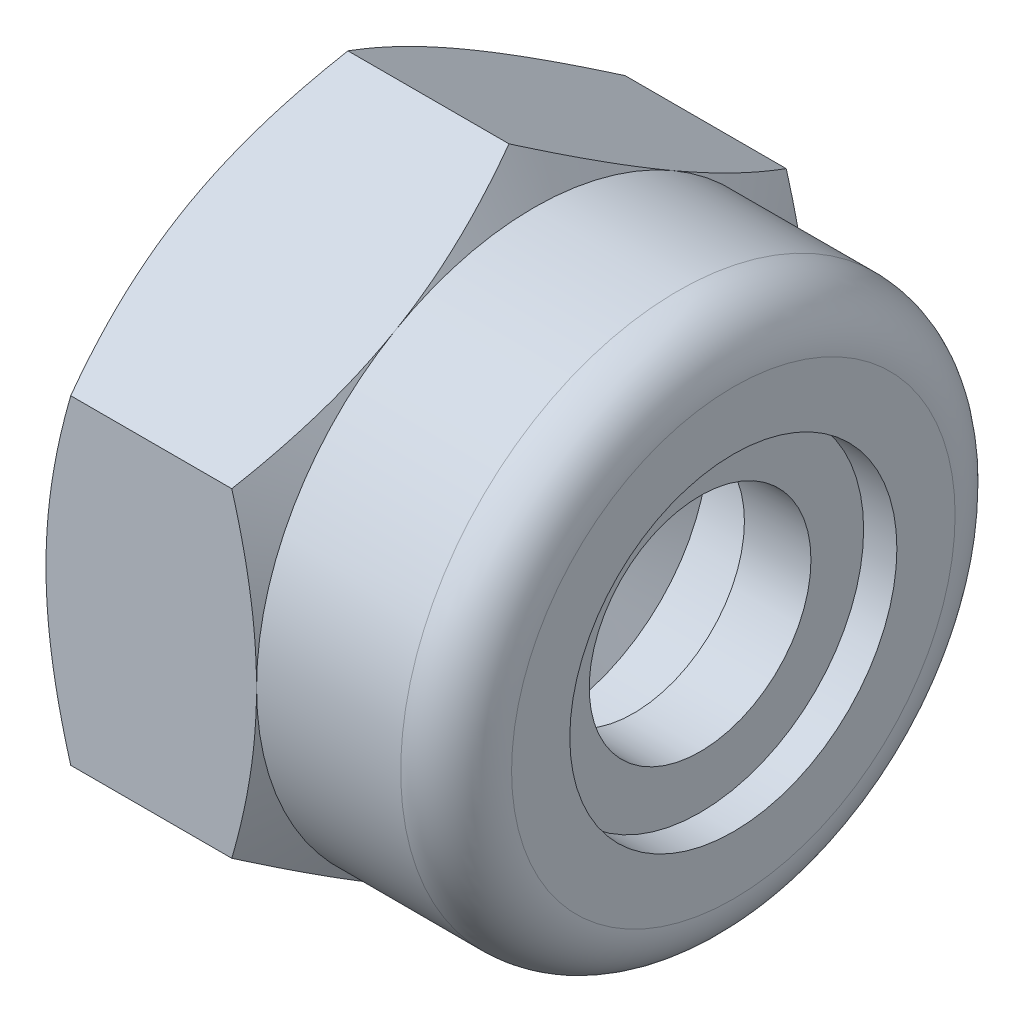
ISO-10303-21;
HEADER;
FILE_DESCRIPTION(('STEP AP214'),'2;1');
FILE_NAME('part.step','',(''),(''),'','','');
FILE_SCHEMA(('AUTOMOTIVE_DESIGN { 1 0 10303 214 1 1 1 1 }'));
ENDSEC;
DATA;
#1=APPLICATION_CONTEXT('core data for automotive mechanical design processes');
#2=APPLICATION_PROTOCOL_DEFINITION('international standard','automotive_design',2000,#1);
#3=PRODUCT_CONTEXT('',#1,'mechanical');
#4=PRODUCT('Part','Part','',(#3));
#5=PRODUCT_RELATED_PRODUCT_CATEGORY('part','',(#4));
#6=PRODUCT_DEFINITION_FORMATION('','',#4);
#7=PRODUCT_DEFINITION_CONTEXT('part definition',#1,'design');
#8=PRODUCT_DEFINITION('design','',#6,#7);
#9=PRODUCT_DEFINITION_SHAPE('','',#8);
#10=(LENGTH_UNIT() NAMED_UNIT(*) SI_UNIT(.MILLI.,.METRE.));
#11=(NAMED_UNIT(*) PLANE_ANGLE_UNIT() SI_UNIT($,.RADIAN.));
#12=(NAMED_UNIT(*) SI_UNIT($,.STERADIAN.) SOLID_ANGLE_UNIT());
#13=UNCERTAINTY_MEASURE_WITH_UNIT(LENGTH_MEASURE(1.E-05),#10,'distance_accuracy_value','');
#14=(GEOMETRIC_REPRESENTATION_CONTEXT(3) GLOBAL_UNCERTAINTY_ASSIGNED_CONTEXT((#13)) GLOBAL_UNIT_ASSIGNED_CONTEXT((#10,
#11,#12)) REPRESENTATION_CONTEXT('',''));
#15=CARTESIAN_POINT('',(0.,0.,0.));
#16=DIRECTION('',(0.,0.,1.));
#17=DIRECTION('',(1.,0.,0.));
#18=AXIS2_PLACEMENT_3D('',#15,#16,#17);
#19=CARTESIAN_POINT('',(3.801,-2.88675134594813,0.));
#20=DIRECTION('',(0.,0.866025403784439,0.5));
#21=DIRECTION('',(0.,-0.5,0.866025403784439));
#22=AXIS2_PLACEMENT_3D('',#19,#20,#21);
#23=PLANE('',#22);
#24=CARTESIAN_POINT('',(0.324252920315603,-1.44337562710054,-2.50000000443889));
#25=CARTESIAN_POINT('',(0.287622335702069,-1.50680326676873,-2.39014015800328));
#26=CARTESIAN_POINT('',(0.254308743347033,-1.5707784016051,-2.27933199376709));
#27=CARTESIAN_POINT('',(0.196160874493555,-1.69983634788501,-2.05579708814923));
#28=CARTESIAN_POINT('',(0.171347166263004,-1.76492145166663,-1.94306637626141));
#29=CARTESIAN_POINT('',(0.132722839049696,-1.89428509469182,-1.71900197010454));
#30=CARTESIAN_POINT('',(0.118655123807044,-1.95854373518774,-1.60770274131095));
#31=CARTESIAN_POINT('',(0.10186434826451,-2.08736321594889,-1.3845808566237));
#32=CARTESIAN_POINT('',(0.0991273804234783,-2.15192358831274,-1.27275901116118));
#33=CARTESIAN_POINT('',(0.104835750413544,-2.27254771379541,-1.06383189697324));
#34=CARTESIAN_POINT('',(0.111879493400295,-2.32862956753363,-0.966695276995339));
#35=CARTESIAN_POINT('',(0.134199510127339,-2.44042791999709,-0.773054850384702));
#36=CARTESIAN_POINT('',(0.149483400873592,-2.49614403233061,-0.676551713001986));
#37=CARTESIAN_POINT('',(0.18769016963491,-2.60817270000859,-0.482512368662393));
#38=CARTESIAN_POINT('',(0.210774928086408,-2.66447108376736,-0.385000707612505));
#39=CARTESIAN_POINT('',(0.263167570547475,-2.77622840386705,-0.191431351090719));
#40=CARTESIAN_POINT('',(0.292463152279787,-2.83168877084305,-0.0953711776861795));
#41=CARTESIAN_POINT('',(0.324252863035129,-2.88675130265926,-7.49785240252429E-08));
#42=B_SPLINE_CURVE_WITH_KNOTS('',3,(#24,#25,#26,#27,#28,#29,#30,#31,#32,#33,#34,#35,#36,#37,#38,
#39,#40,#41),.UNSPECIFIED.,.F.,.F.,(4,2,2,2,2,2,2,2,4),(0.,0.396270023168304,0.793492288044913,
1.18088453121035,1.56780114168793,1.90463473745514,2.24178022975287,2.58640199361272,
2.93034741081188),.UNSPECIFIED.);
#43=CARTESIAN_POINT('',(0.324252892837931,-1.44337566464297,-2.50000001442988));
#44=VERTEX_POINT('',#43);
#45=CARTESIAN_POINT('',(0.324252892836171,-2.88675135427618,-1.44246030499073E-08));
#46=VERTEX_POINT('',#45);
#47=EDGE_CURVE('E120',#44,#46,#42,.T.);
#48=ORIENTED_EDGE('',*,*,#47,.F.);
#49=DIRECTION('',(1.,0.,0.));
#50=VECTOR('',#49,1.);
#51=CARTESIAN_POINT('',(3.801,-1.44337567297414,-2.49999999999986));
#52=LINE('',#51,#50);
#53=CARTESIAN_POINT('',(1.77670900631172,-1.44337567297443,-2.50000000000037));
#54=VERTEX_POINT('',#53);
#55=EDGE_CURVE('E124',#54,#44,#52,.F.);
#56=ORIENTED_EDGE('',*,*,#55,.F.);
#57=CARTESIAN_POINT('',(2.00000000000824,-2.1650635094611,-1.25));
#58=CARTESIAN_POINT('',(2.00000781251923,-2.13443012113611,-1.30305858498687));
#59=CARTESIAN_POINT('',(1.9986989024449,-2.10380089093656,-1.35610996788921));
#60=CARTESIAN_POINT('',(1.99351636247017,-2.04260257269059,-1.462108564429));
#61=CARTESIAN_POINT('',(1.98964324030326,-2.01203347393929,-1.51505579660785));
#62=CARTESIAN_POINT('',(1.97433271109433,-1.92079117167452,-1.67309209992997));
#63=CARTESIAN_POINT('',(1.95920267491783,-1.86026561761744,-1.7779254347131));
#64=CARTESIAN_POINT('',(1.92029536388515,-1.74001256698161,-1.98620982817951));
#65=CARTESIAN_POINT('',(1.89652773316183,-1.68028425706462,-2.08966229560596));
#66=CARTESIAN_POINT('',(1.84171388393095,-1.56134139506079,-2.29567737579423));
#67=CARTESIAN_POINT('',(1.81063131493144,-1.50213099242487,-2.39823280149626));
#68=CARTESIAN_POINT('',(1.77670900631177,-1.44337567297364,-2.50000000000074));
#69=B_SPLINE_CURVE_WITH_KNOTS('',3,(#57,#58,#59,#60,#61,#62,#63,#64,#65,#66,#67,#68),
.UNSPECIFIED.,.F.,.F.,(4,2,2,2,2,4),(0.,0.183770844250406,0.367505311354719,0.733076121363491,
1.09824000837607,1.46525833757183),.UNSPECIFIED.);
#70=CARTESIAN_POINT('',(2.00000000000412,-2.1650635094611,-1.25));
#71=VERTEX_POINT('',#70);
#72=EDGE_CURVE('E111',#71,#54,#69,.T.);
#73=ORIENTED_EDGE('',*,*,#72,.F.);
#74=CARTESIAN_POINT('',(1.77670900631166,-2.88675134594874,1.06484877804142E-12));
#75=CARTESIAN_POINT('',(1.81063131493134,-2.8279960264975,-0.101767198503436));
#76=CARTESIAN_POINT('',(1.84171388393087,-2.76878562386156,-0.204322624205487));
#77=CARTESIAN_POINT('',(1.89652773316177,-2.64984276185771,-0.410337704393817));
#78=CARTESIAN_POINT('',(1.9202953638851,-2.5901144519407,-0.51379017182029));
#79=CARTESIAN_POINT('',(1.95920267491781,-2.46986140130484,-0.722074565286756));
#80=CARTESIAN_POINT('',(1.97433271109431,-2.40933584724774,-0.82690790006991));
#81=CARTESIAN_POINT('',(1.98964324030326,-2.31809354498295,-0.984944203392079));
#82=CARTESIAN_POINT('',(1.99351636247017,-2.28752444623164,-1.03789143557094));
#83=CARTESIAN_POINT('',(1.9986989024449,-2.22632612798565,-1.14389003211076));
#84=CARTESIAN_POINT('',(2.00000781251923,-2.1956968977861,-1.19694141501311));
#85=CARTESIAN_POINT('',(2.00000000000824,-2.1650635094611,-1.25));
#86=B_SPLINE_CURVE_WITH_KNOTS('',3,(#74,#75,#76,#77,#78,#79,#80,#81,#82,#83,#84,#85),
.UNSPECIFIED.,.F.,.F.,(4,2,2,2,2,4),(0.,0.367018329195855,0.732182216208531,1.0977530262174,
1.28148749332176,1.46525833757222),.UNSPECIFIED.);
#87=CARTESIAN_POINT('',(1.77670900631166,-2.88675134594874,0.));
#88=VERTEX_POINT('',#87);
#89=EDGE_CURVE('E97',#88,#71,#86,.T.);
#90=ORIENTED_EDGE('',*,*,#89,.F.);
#91=DIRECTION('',(1.,0.,0.));
#92=VECTOR('',#91,1.);
#93=CARTESIAN_POINT('',(3.801,-2.88675134594813,0.));
#94=LINE('',#93,#92);
#95=EDGE_CURVE('E103',#88,#46,#94,.F.);
#96=ORIENTED_EDGE('',*,*,#95,.T.);
#97=EDGE_LOOP('',(#48,#56,#73,#90,#96));
#98=FACE_BOUND('',#97,.T.);
#99=ADVANCED_FACE('F17',(#98),#23,.F.);
#100=CARTESIAN_POINT('',(3.801,-1.44337567297406,2.5));
#101=DIRECTION('',(0.,0.866025403784439,-0.5));
#102=DIRECTION('',(0.,0.5,0.866025403784439));
#103=AXIS2_PLACEMENT_3D('',#100,#101,#102);
#104=PLANE('',#103);
#105=CARTESIAN_POINT('',(0.324252920296346,-2.88675132687413,-4.19273291454504E-08));
#106=CARTESIAN_POINT('',(0.287622335693659,-2.82332372882424,0.109859828537716));
#107=CARTESIAN_POINT('',(0.254308743343429,-2.75934861106157,0.220668002630687));
#108=CARTESIAN_POINT('',(0.196160874494061,-2.63029067730084,0.444202915473586));
#109=CARTESIAN_POINT('',(0.171347166262811,-2.56520556891263,0.556933624699607));
#110=CARTESIAN_POINT('',(0.132722839049245,-2.43584192261218,0.780998028961931));
#111=CARTESIAN_POINT('',(0.11865512380703,-2.37158328330348,0.892297258439541));
#112=CARTESIAN_POINT('',(0.101864348264771,-2.24276380340565,1.11541914362221));
#113=CARTESIAN_POINT('',(0.0991273804235726,-2.17820343071977,1.2272409888972));
#114=CARTESIAN_POINT('',(0.104835750413159,-2.05757930503713,1.43616810296488));
#115=CARTESIAN_POINT('',(0.111879493399489,-2.00149745136899,1.53330472298003));
#116=CARTESIAN_POINT('',(0.134199510125296,-1.88969909895897,1.72694514961523));
#117=CARTESIAN_POINT('',(0.149483400870735,-1.83398298660874,1.82344828698519));
#118=CARTESIAN_POINT('',(0.187690169630089,-1.72195431891877,2.0174876313114));
#119=CARTESIAN_POINT('',(0.210774928080413,-1.66565593516519,2.11499929236093));
#120=CARTESIAN_POINT('',(0.263167570538905,-1.55389861507584,2.30856864888203));
#121=CARTESIAN_POINT('',(0.292463152269813,-1.498438248105,2.40462882228624));
#122=CARTESIAN_POINT('',(0.324252863023689,-1.44337571628275,2.49999992498716));
#123=B_SPLINE_CURVE_WITH_KNOTS('',3,(#105,#106,#107,#108,#109,#110,#111,#112,#113,#114,#115,
#116,#117,#118,#119,#120,#121,#122),.UNSPECIFIED.,.F.,.F.,(4,2,2,2,2,2,2,2,4),(0.,
0.396270023162889,0.793492288034561,1.18088453119609,1.56780114166958,1.90463473742841,
2.24178022971785,2.58640199356846,2.93034741075827),.UNSPECIFIED.);
#124=CARTESIAN_POINT('',(0.324252892835598,-1.44337568962818,2.5));
#125=VERTEX_POINT('',#124);
#126=EDGE_CURVE('E116',#46,#125,#123,.T.);
#127=ORIENTED_EDGE('',*,*,#126,.F.);
#128=ORIENTED_EDGE('',*,*,#95,.F.);
#129=CARTESIAN_POINT('',(2.00000000000824,-2.1650635094611,1.25));
#130=CARTESIAN_POINT('',(2.00000781251923,-2.1956968977861,1.19694141501311));
#131=CARTESIAN_POINT('',(1.9986989024449,-2.22632612798565,1.14389003211076));
#132=CARTESIAN_POINT('',(1.99351636247017,-2.28752444623164,1.03789143557094));
#133=CARTESIAN_POINT('',(1.98964324030326,-2.31809354498295,0.984944203392079));
#134=CARTESIAN_POINT('',(1.97433271109431,-2.40933584724774,0.82690790006991));
#135=CARTESIAN_POINT('',(1.95920267491781,-2.46986140130484,0.722074565286756));
#136=CARTESIAN_POINT('',(1.9202953638851,-2.5901144519407,0.513790171820291));
#137=CARTESIAN_POINT('',(1.89652773316177,-2.64984276185771,0.410337704393817));
#138=CARTESIAN_POINT('',(1.84171388393087,-2.76878562386156,0.204322624205487));
#139=CARTESIAN_POINT('',(1.81063131493134,-2.8279960264975,0.101767198503436));
#140=CARTESIAN_POINT('',(1.77670900631166,-2.88675134594874,-1.06488478110508E-12));
#141=B_SPLINE_CURVE_WITH_KNOTS('',3,(#129,#130,#131,#132,#133,#134,#135,#136,#137,#138,#139,
#140),.UNSPECIFIED.,.F.,.F.,(4,2,2,2,2,4),(0.,0.183770844250456,0.367505311354819,
0.733076121363689,1.09824000837636,1.46525833757222),.UNSPECIFIED.);
#142=CARTESIAN_POINT('',(2.00000000000412,-2.1650635094611,1.25));
#143=VERTEX_POINT('',#142);
#144=EDGE_CURVE('E94',#143,#88,#141,.T.);
#145=ORIENTED_EDGE('',*,*,#144,.F.);
#146=CARTESIAN_POINT('',(1.77670900631171,-1.44337567297354,2.50000000000092));
#147=CARTESIAN_POINT('',(1.81063131493138,-1.50213099242478,2.39823280149643));
#148=CARTESIAN_POINT('',(1.84171388393091,-1.56134139506071,2.29567737579439));
#149=CARTESIAN_POINT('',(1.8965277331618,-1.68028425706455,2.08966229560608));
#150=CARTESIAN_POINT('',(1.92029536388512,-1.74001256698154,1.98620982817962));
#151=CARTESIAN_POINT('',(1.95920267491782,-1.86026561761739,1.77792543471318));
#152=CARTESIAN_POINT('',(1.97433271109432,-1.92079117167449,1.67309209993004));
#153=CARTESIAN_POINT('',(1.98964324030326,-2.01203347393926,1.51505579660789));
#154=CARTESIAN_POINT('',(1.99351636247017,-2.04260257269057,1.46210856442903));
#155=CARTESIAN_POINT('',(1.9986989024449,-2.10380089093655,1.35610996788923));
#156=CARTESIAN_POINT('',(2.00000781251923,-2.1344301211361,1.30305858498688));
#157=CARTESIAN_POINT('',(2.00000000000824,-2.1650635094611,1.25));
#158=B_SPLINE_CURVE_WITH_KNOTS('',3,(#146,#147,#148,#149,#150,#151,#152,#153,#154,#155,#156,
#157),.UNSPECIFIED.,.F.,.F.,(4,2,2,2,2,4),(0.,0.367018329195811,0.732182216208443,
1.09775302621727,1.28148749332161,1.46525833757204),.UNSPECIFIED.);
#159=CARTESIAN_POINT('',(1.77670900631186,-1.44337567297459,2.5));
#160=VERTEX_POINT('',#159);
#161=EDGE_CURVE('E104',#160,#143,#158,.T.);
#162=ORIENTED_EDGE('',*,*,#161,.F.);
#163=DIRECTION('',(1.,0.,0.));
#164=VECTOR('',#163,1.);
#165=CARTESIAN_POINT('',(3.801,-1.44337567297406,2.5));
#166=LINE('',#165,#164);
#167=EDGE_CURVE('E118',#125,#160,#166,.T.);
#168=ORIENTED_EDGE('',*,*,#167,.F.);
#169=EDGE_LOOP('',(#127,#128,#145,#162,#168));
#170=FACE_BOUND('',#169,.T.);
#171=ADVANCED_FACE('F113',(#170),#104,.F.);
#172=CARTESIAN_POINT('',(0.,0.,0.));
#173=DIRECTION('',(-1.,0.,0.));
#174=DIRECTION('',(0.,0.,1.));
#175=AXIS2_PLACEMENT_3D('',#172,#173,#174);
#176=CONICAL_SURFACE('',#175,1.47500000002765,1.04719755119663);
#177=CARTESIAN_POINT('',(0.274241377865073,0.,0.));
#178=DIRECTION('',(1.,0.,0.));
#179=DIRECTION('',(0.,0.,-1.));
#180=AXIS2_PLACEMENT_3D('',#177,#178,#179);
#181=CIRCLE('',#180,1.);
#182=CARTESIAN_POINT('',(0.274241377865073,0.,-1.));
#183=VERTEX_POINT('',#182);
#184=EDGE_CURVE('E240',#183,#183,#181,.T.);
#185=ORIENTED_EDGE('',*,*,#184,.T.);
#186=EDGE_LOOP('',(#185));
#187=FACE_BOUND('',#186,.T.);
#188=CARTESIAN_POINT('',(0.,0.,0.));
#189=DIRECTION('',(-1.,0.,0.));
#190=DIRECTION('',(0.,0.,1.));
#191=AXIS2_PLACEMENT_3D('',#188,#189,#190);
#192=CIRCLE('',#191,1.47500000002765);
#193=CARTESIAN_POINT('',(0.,0.,1.47500000002765));
#194=VERTEX_POINT('',#193);
#195=EDGE_CURVE('E242',#194,#194,#192,.F.);
#196=ORIENTED_EDGE('',*,*,#195,.F.);
#197=EDGE_LOOP('',(#196));
#198=FACE_BOUND('',#197,.T.);
#199=ADVANCED_FACE('F452',(#187,#198),#176,.F.);
#200=CARTESIAN_POINT('',(3.8,0.,0.));
#201=DIRECTION('',(1.,0.,0.));
#202=DIRECTION('',(0.,0.,-1.));
#203=AXIS2_PLACEMENT_3D('',#200,#201,#202);
#204=CYLINDRICAL_SURFACE('',#203,1.);
#205=CARTESIAN_POINT('',(1.82672051647614,0.,0.));
#206=DIRECTION('',(1.,0.,0.));
#207=DIRECTION('',(0.,0.,-1.));
#208=AXIS2_PLACEMENT_3D('',#205,#206,#207);
#209=CIRCLE('',#208,0.999999999976353);
#210=CARTESIAN_POINT('',(1.82672051647614,0.,-0.999999999976353));
#211=VERTEX_POINT('',#210);
#212=EDGE_CURVE('E234',#211,#211,#209,.T.);
#213=ORIENTED_EDGE('',*,*,#212,.T.);
#214=EDGE_LOOP('',(#213));
#215=FACE_BOUND('',#214,.T.);
#216=ORIENTED_EDGE('',*,*,#184,.F.);
#217=EDGE_LOOP('',(#216));
#218=FACE_BOUND('',#217,.T.);
#219=ADVANCED_FACE('F449',(#215,#218),#204,.F.);
#220=CARTESIAN_POINT('',(0.,2.32512886940356,0.));
#221=DIRECTION('',(-1.,0.,0.));
#222=DIRECTION('',(0.,0.,1.));
#223=AXIS2_PLACEMENT_3D('',#220,#221,#222);
#224=PLANE('',#223);
#225=CARTESIAN_POINT('',(-1.52311973797281E-11,0.,0.));
#226=DIRECTION('',(1.,0.,0.));
#227=DIRECTION('',(0.,0.,-1.));
#228=AXIS2_PLACEMENT_3D('',#225,#226,#227);
#229=CIRCLE('',#228,2.32512886935865);
#230=CARTESIAN_POINT('',(-1.52311973797281E-11,0.,-2.32512886935865));
#231=VERTEX_POINT('',#230);
#232=EDGE_CURVE('E239',#231,#231,#229,.T.);
#233=ORIENTED_EDGE('',*,*,#232,.F.);
#234=EDGE_LOOP('',(#233));
#235=FACE_BOUND('',#234,.T.);
#236=ORIENTED_EDGE('',*,*,#195,.T.);
#237=EDGE_LOOP('',(#236));
#238=FACE_BOUND('',#237,.T.);
#239=ADVANCED_FACE('F305',(#235,#238),#224,.T.);
#240=CARTESIAN_POINT('',(3.801,2.88675134594813,0.));
#241=DIRECTION('',(0.,-0.866025403784439,-0.5));
#242=DIRECTION('',(0.,0.5,-0.866025403784439));
#243=AXIS2_PLACEMENT_3D('',#240,#241,#242);
#244=PLANE('',#243);
#245=CARTESIAN_POINT('',(0.324252920315311,1.443375627101,2.5000000044384));
#246=CARTESIAN_POINT('',(0.287622335701857,1.5068032667691,2.39014015800274));
#247=CARTESIAN_POINT('',(0.254308743346865,1.57077840160543,2.27933199376654));
#248=CARTESIAN_POINT('',(0.196160874493444,1.6998363478853,2.05579708814871));
#249=CARTESIAN_POINT('',(0.171347166262905,1.76492145166691,1.94306637626091));
#250=CARTESIAN_POINT('',(0.132722839049628,1.89428509469209,1.71900197010407));
#251=CARTESIAN_POINT('',(0.118655123806995,1.958543735188,1.6077027413105));
#252=CARTESIAN_POINT('',(0.101864348264494,2.08736321594913,1.38458085662329));
#253=CARTESIAN_POINT('',(0.0991273804234762,2.15192358831297,1.27275901116078));
#254=CARTESIAN_POINT('',(0.10483575041356,2.27254771379551,1.06383189697306));
#255=CARTESIAN_POINT('',(0.111879493400299,2.32862956753361,0.966695276995364));
#256=CARTESIAN_POINT('',(0.134199510127283,2.44042791999685,0.77305485038513));
#257=CARTESIAN_POINT('',(0.149483400873489,2.49614403233025,0.676551713002614));
#258=CARTESIAN_POINT('',(0.187690169634685,2.60817270000799,0.482512368663427));
#259=CARTESIAN_POINT('',(0.210774928086105,2.66447108376665,0.385000707613745));
#260=CARTESIAN_POINT('',(0.263167570546997,2.77622840386611,0.191431351092364));
#261=CARTESIAN_POINT('',(0.29246315227921,2.83168877084198,0.0953711776880236));
#262=CARTESIAN_POINT('',(0.324252863034449,2.88675130265808,7.49805642180318E-08));
#263=B_SPLINE_CURVE_WITH_KNOTS('',3,(#245,#246,#247,#248,#249,#250,#251,#252,#253,#254,#255,
#256,#257,#258,#259,#260,#261,#262),.UNSPECIFIED.,.F.,.F.,(4,2,2,2,2,2,2,2,4),(0.,
0.396270023168229,0.793492288044763,1.18088453121014,1.56780114168766,1.90463473745416,
2.24178022975119,2.5864019936103,2.93034741080872),.UNSPECIFIED.);
#264=CARTESIAN_POINT('',(0.324252892837855,1.4433756646431,2.50000001442966));
#265=VERTEX_POINT('',#264);
#266=CARTESIAN_POINT('',(0.324252875531209,2.8867513243031,3.74902820057411E-08));
#267=VERTEX_POINT('',#266);
#268=EDGE_CURVE('E295',#265,#267,#263,.T.);
#269=ORIENTED_EDGE('',*,*,#268,.F.);
#270=DIRECTION('',(1.,0.,0.));
#271=VECTOR('',#270,1.);
#272=CARTESIAN_POINT('',(3.801,1.44337567297406,2.5));
#273=LINE('',#272,#271);
#274=CARTESIAN_POINT('',(1.77670901400036,1.44337562132957,2.50000001444026));
#275=VERTEX_POINT('',#274);
#276=EDGE_CURVE('E235',#275,#265,#273,.F.);
#277=ORIENTED_EDGE('',*,*,#276,.F.);
#278=CARTESIAN_POINT('',(2.00000000000824,2.1650635094611,1.25));
#279=CARTESIAN_POINT('',(2.00000781251997,2.13443012040616,1.30305858625118));
#280=CARTESIAN_POINT('',(1.99869890238286,2.10380088947696,1.3561099704173));
#281=CARTESIAN_POINT('',(1.99351636216204,2.04260256977623,1.46210856947681));
#282=CARTESIAN_POINT('',(1.9896432398119,2.01203347029981,1.5150558029116));
#283=CARTESIAN_POINT('',(1.97433270988644,1.92079116588787,1.67309210995275));
#284=CARTESIAN_POINT('',(1.95920267300966,1.86026561041902,1.77792544718113));
#285=CARTESIAN_POINT('',(1.92029536023768,1.74001255701156,1.98620984544814));
#286=CARTESIAN_POINT('',(1.89652772847644,1.68028424573459,2.08966231523014));
#287=CARTESIAN_POINT('',(1.84171387692881,1.56134138103604,2.29567740008581));
#288=CARTESIAN_POINT('',(1.81063130664809,1.50213097706573,2.39823282809908));
#289=CARTESIAN_POINT('',(1.77670899668517,1.44337565629989,2.50000002888051));
#290=B_SPLINE_CURVE_WITH_KNOTS('',3,(#278,#279,#280,#281,#282,#283,#284,#285,#286,#287,#288,
#289),.UNSPECIFIED.,.F.,.F.,(4,2,2,2,2,4),(0.,0.183770848628005,0.367505320105658,
0.733076138754352,1.09824003436722,1.46525837226858),.UNSPECIFIED.);
#291=CARTESIAN_POINT('',(2.00000000000412,2.1650635094611,1.25));
#292=VERTEX_POINT('',#291);
#293=EDGE_CURVE('E237',#292,#275,#290,.T.);
#294=ORIENTED_EDGE('',*,*,#293,.F.);
#295=CARTESIAN_POINT('',(1.77670900631171,2.88675134594866,-9.17221602441658E-13));
#296=CARTESIAN_POINT('',(1.81063131493138,2.82799602649742,0.101767198503572));
#297=CARTESIAN_POINT('',(1.84171388393091,2.76878562386149,0.204322624205611));
#298=CARTESIAN_POINT('',(1.8965277331618,2.64984276185765,0.410337704393917));
#299=CARTESIAN_POINT('',(1.92029536388512,2.59011445194065,0.513790171820379));
#300=CARTESIAN_POINT('',(1.95920267491782,2.4698614013048,0.72207456528682));
#301=CARTESIAN_POINT('',(1.97433271109432,2.40933584724771,0.826907900069961));
#302=CARTESIAN_POINT('',(1.98964324030326,2.31809354498293,0.984944203392112));
#303=CARTESIAN_POINT('',(1.99351636247017,2.28752444623163,1.03789143557096));
#304=CARTESIAN_POINT('',(1.9986989024449,2.22632612798565,1.14389003211077));
#305=CARTESIAN_POINT('',(2.00000781251923,2.19569689778609,1.19694141501312));
#306=CARTESIAN_POINT('',(2.00000000000824,2.1650635094611,1.25));
#307=B_SPLINE_CURVE_WITH_KNOTS('',3,(#295,#296,#297,#298,#299,#300,#301,#302,#303,#304,#305,
#306),.UNSPECIFIED.,.F.,.F.,(4,2,2,2,2,4),(0.,0.367018329195811,0.732182216208442,
1.09775302621727,1.28148749332161,1.46525833757204),.UNSPECIFIED.);
#308=CARTESIAN_POINT('',(1.77670900631186,2.88675134594839,4.58081715115774E-13));
#309=VERTEX_POINT('',#308);
#310=EDGE_CURVE('E246',#309,#292,#307,.T.);
#311=ORIENTED_EDGE('',*,*,#310,.F.);
#312=DIRECTION('',(1.,0.,0.));
#313=VECTOR('',#312,1.);
#314=CARTESIAN_POINT('',(3.801,2.88675134594813,0.));
#315=LINE('',#314,#313);
#316=EDGE_CURVE('E232',#267,#309,#315,.T.);
#317=ORIENTED_EDGE('',*,*,#316,.F.);
#318=EDGE_LOOP('',(#269,#277,#294,#311,#317));
#319=FACE_BOUND('',#318,.T.);
#320=ADVANCED_FACE('F301',(#319),#244,.F.);
#321=CARTESIAN_POINT('',(2.10096189420028,0.,0.));
#322=DIRECTION('',(1.,0.,0.));
#323=DIRECTION('',(0.,0.,-1.));
#324=AXIS2_PLACEMENT_3D('',#321,#322,#323);
#325=CONICAL_SURFACE('',#324,1.47499999974343,1.04719755118274);
#326=CARTESIAN_POINT('',(2.10096189432335,0.,0.));
#327=DIRECTION('',(1.,0.,0.));
#328=DIRECTION('',(0.,0.,-1.));
#329=AXIS2_PLACEMENT_3D('',#326,#327,#328);
#330=CIRCLE('',#329,1.475);
#331=CARTESIAN_POINT('',(2.10096189432335,0.,-1.475));
#332=VERTEX_POINT('',#331);
#333=EDGE_CURVE('E228',#332,#332,#330,.T.);
#334=ORIENTED_EDGE('',*,*,#333,.T.);
#335=EDGE_LOOP('',(#334));
#336=FACE_BOUND('',#335,.T.);
#337=ORIENTED_EDGE('',*,*,#212,.F.);
#338=EDGE_LOOP('',(#337));
#339=FACE_BOUND('',#338,.T.);
#340=ADVANCED_FACE('F267',(#336,#339),#325,.F.);
#341=CARTESIAN_POINT('',(0.326198405275591,0.,0.));
#342=DIRECTION('',(1.,0.,0.));
#343=DIRECTION('',(0.,0.,-1.));
#344=AXIS2_PLACEMENT_3D('',#341,#342,#343);
#345=CONICAL_SURFACE('',#344,2.890121080668,1.04719755119483);
#346=ORIENTED_EDGE('',*,*,#232,.T.);
#347=EDGE_LOOP('',(#346));
#348=FACE_BOUND('',#347,.T.);
#349=CARTESIAN_POINT('',(0.324252888027726,1.44337567297322,-2.5));
#350=CARTESIAN_POINT('',(0.290045105625109,1.32488884240148,-2.5));
#351=CARTESIAN_POINT('',(0.258726914570833,1.20546467611319,-2.5));
#352=CARTESIAN_POINT('',(0.203375896967413,0.96467638085958,-2.5));
#353=CARTESIAN_POINT('',(0.179359370975906,0.843308538932506,-2.5));
#354=CARTESIAN_POINT('',(0.140737890303666,0.601934710580501,-2.5));
#355=CARTESIAN_POINT('',(0.125927022041303,0.481962707668559,-2.5));
#356=CARTESIAN_POINT('',(0.106044309740174,0.241326540249004,-2.5));
#357=CARTESIAN_POINT('',(0.100961894336071,0.120663270126217,-2.5));
#358=CARTESIAN_POINT('',(0.100961894332844,-0.120663262786056,-2.5));
#359=CARTESIAN_POINT('',(0.106044309116501,-0.241326525575543,-2.5));
#360=CARTESIAN_POINT('',(0.125927019037019,-0.481962678450746,-2.5));
#361=CARTESIAN_POINT('',(0.140737885536313,-0.601934674151943,-2.5));
#362=CARTESIAN_POINT('',(0.17935936173101,-0.843308487958175,-2.5));
#363=CARTESIAN_POINT('',(0.203375884973844,-0.964676322557829,-2.5));
#364=CARTESIAN_POINT('',(0.258726896459102,-1.20546460344747,-2.5));
#365=CARTESIAN_POINT('',(0.290045084148069,-1.32488876269806,-2.5));
#366=CARTESIAN_POINT('',(0.324252863018951,-1.44337558634028,-2.5));
#367=B_SPLINE_CURVE_WITH_KNOTS('',3,(#349,#350,#351,#352,#353,#354,#355,#356,#357,#358,#359,
#360,#361,#362,#363,#364,#365,#366),.UNSPECIFIED.,.F.,.F.,(4,2,2,2,2,2,2,2,4),(0.,
0.370091744777794,0.741003732352905,1.1032885737832,1.46517951656474,1.82707043737194,
2.18935525674199,2.56026722118369,2.93035894301883),.UNSPECIFIED.);
#368=CARTESIAN_POINT('',(0.324252888027726,1.44337567297385,-2.49999999999963));
#369=VERTEX_POINT('',#368);
#370=EDGE_CURVE('E231',#369,#44,#367,.T.);
#371=ORIENTED_EDGE('',*,*,#370,.T.);
#372=ORIENTED_EDGE('',*,*,#47,.T.);
#373=ORIENTED_EDGE('',*,*,#126,.T.);
#374=CARTESIAN_POINT('',(0.32425292030784,-1.44337569973958,2.49999996249685));
#375=CARTESIAN_POINT('',(0.290045121847081,-1.32488887005759,2.49999998653369));
#376=CARTESIAN_POINT('',(0.258726923446699,-1.20546470236758,2.49999999639158));
#377=CARTESIAN_POINT('',(0.203375899082222,-0.964676402440517,2.50000000361642));
#378=CARTESIAN_POINT('',(0.179359373680464,-0.843308557240026,2.50000000095565));
#379=CARTESIAN_POINT('',(0.14073789255088,-0.601934723248815,2.49999999906658));
#380=CARTESIAN_POINT('',(0.125927023252747,-0.481962717965396,2.4999999997599));
#381=CARTESIAN_POINT('',(0.10604430981603,-0.241326545524017,2.50000000023984));
#382=CARTESIAN_POINT('',(0.100961894318436,-0.120663272750467,2.50000000002746));
#383=CARTESIAN_POINT('',(0.10096189439632,0.12066326267805,2.49999999989314));
#384=CARTESIAN_POINT('',(0.106044309123254,0.241326525333016,2.49999999997119));
#385=CARTESIAN_POINT('',(0.12592701896309,0.481962677880762,2.50000000002884));
#386=CARTESIAN_POINT('',(0.140737885432755,0.601934673389518,2.50000000000832));
#387=CARTESIAN_POINT('',(0.179359361577325,0.843308487115904,2.49999999999148));
#388=CARTESIAN_POINT('',(0.203375884821188,0.964676321824528,2.49999999999575));
#389=CARTESIAN_POINT('',(0.258726896347991,1.20546460303327,2.50000000000425));
#390=CARTESIAN_POINT('',(0.290045084083795,1.32488876249255,2.50000000000848));
#391=CARTESIAN_POINT('',(0.324252863019175,1.44337558634105,2.5));
#392=B_SPLINE_CURVE_WITH_KNOTS('',3,(#374,#375,#376,#377,#378,#379,#380,#381,#382,#383,#384,
#385,#386,#387,#388,#389,#390,#391),.UNSPECIFIED.,.F.,.F.,(4,2,2,2,2,2,2,2,4),(0.,
0.37009175438155,0.741003750937875,1.10328859995854,1.46517955059621,1.82707047102381,
2.18935528980107,2.56026725456585,2.9303589770435),.UNSPECIFIED.);
#393=EDGE_CURVE('E274',#125,#265,#392,.T.);
#394=ORIENTED_EDGE('',*,*,#393,.T.);
#395=ORIENTED_EDGE('',*,*,#268,.T.);
#396=CARTESIAN_POINT('',(0.324252920296668,2.88675132687136,4.19258634569556E-08));
#397=CARTESIAN_POINT('',(0.287622335685338,2.82332372880839,-0.10985982856399));
#398=CARTESIAN_POINT('',(0.254308743328205,2.75934861103185,-0.220668002681844));
#399=CARTESIAN_POINT('',(0.196160874468773,2.63029067724065,-0.444202915578162));
#400=CARTESIAN_POINT('',(0.17134716623461,2.5652055688358,-0.556933624832766));
#401=CARTESIAN_POINT('',(0.132722839030653,2.43584192253275,-0.780998029099426));
#402=CARTESIAN_POINT('',(0.118655123796011,2.37158328323846,-0.892297258552126));
#403=CARTESIAN_POINT('',(0.101864348262927,2.24276380337204,-1.11541914368044));
#404=CARTESIAN_POINT('',(0.0991273804230955,2.17820343070316,-1.22724098892597));
#405=CARTESIAN_POINT('',(0.104835750587408,2.05757930137831,-1.43616810930215));
#406=CARTESIAN_POINT('',(0.111879494320995,2.0014974440588,-1.53330473564166));
#407=CARTESIAN_POINT('',(0.13419951356926,1.88969908440672,-1.72694517482046));
#408=CARTESIAN_POINT('',(0.149483406092337,1.83398296846594,-1.82344831840944));
#409=CARTESIAN_POINT('',(0.187690179284085,1.72195429351176,-2.01748767531763));
#410=CARTESIAN_POINT('',(0.210774940421271,1.66565590608808,-2.11499934272396));
#411=CARTESIAN_POINT('',(0.263167588837814,1.55389857879207,-2.30856871172736));
#412=CARTESIAN_POINT('',(0.292463173836354,1.49843820828418,-2.40462889125792));
#413=CARTESIAN_POINT('',(0.324252888027726,1.44337567297449,-2.49999999999927));
#414=B_SPLINE_CURVE_WITH_KNOTS('',3,(#396,#397,#398,#399,#400,#401,#402,#403,#404,#405,#406,
#407,#408,#409,#410,#411,#412,#413),.UNSPECIFIED.,.F.,.F.,(4,2,2,2,2,2,2,2,4),(0.,
0.396270023250656,0.793492288221313,1.18088453129374,1.56780114166997,1.9046347593681,
2.24178027367799,2.5864020606926,2.93034750087004),.UNSPECIFIED.);
#415=EDGE_CURVE('E227',#267,#369,#414,.T.);
#416=ORIENTED_EDGE('',*,*,#415,.T.);
#417=EDGE_LOOP('',(#371,#372,#373,#394,#395,#416));
#418=FACE_BOUND('',#417,.T.);
#419=ADVANCED_FACE('F261',(#348,#418),#345,.T.);
#420=CARTESIAN_POINT('',(3.8,0.,0.));
#421=DIRECTION('',(1.,0.,0.));
#422=DIRECTION('',(0.,0.,-1.));
#423=AXIS2_PLACEMENT_3D('',#420,#421,#422);
#424=CYLINDRICAL_SURFACE('',#423,1.475);
#425=CARTESIAN_POINT('',(2.9,0.,0.));
#426=DIRECTION('',(1.,0.,0.));
#427=DIRECTION('',(0.,0.,-1.));
#428=AXIS2_PLACEMENT_3D('',#425,#426,#427);
#429=CIRCLE('',#428,1.475);
#430=CARTESIAN_POINT('',(2.9,0.,-1.475));
#431=VERTEX_POINT('',#430);
#432=EDGE_CURVE('E226',#431,#431,#429,.F.);
#433=ORIENTED_EDGE('',*,*,#432,.F.);
#434=EDGE_LOOP('',(#433));
#435=FACE_BOUND('',#434,.T.);
#436=ORIENTED_EDGE('',*,*,#333,.F.);
#437=EDGE_LOOP('',(#436));
#438=FACE_BOUND('',#437,.T.);
#439=ADVANCED_FACE('F266',(#435,#438),#424,.F.);
#440=CARTESIAN_POINT('',(3.801,1.44337567297406,-2.5));
#441=DIRECTION('',(0.,-0.866025403784439,0.5));
#442=DIRECTION('',(0.,-0.5,-0.866025403784439));
#443=AXIS2_PLACEMENT_3D('',#440,#441,#442);
#444=PLANE('',#443);
#445=ORIENTED_EDGE('',*,*,#415,.F.);
#446=ORIENTED_EDGE('',*,*,#316,.T.);
#447=CARTESIAN_POINT('',(2.00000000000824,2.1650635094611,-1.25));
#448=CARTESIAN_POINT('',(2.00000781251923,2.19569689778609,-1.19694141501312));
#449=CARTESIAN_POINT('',(1.9986989024449,2.22632612798565,-1.14389003211077));
#450=CARTESIAN_POINT('',(1.99351636247017,2.28752444623162,-1.03789143557097));
#451=CARTESIAN_POINT('',(1.98964324030326,2.31809354498293,-0.984944203392112));
#452=CARTESIAN_POINT('',(1.97433271109432,2.40933584724771,-0.826907900069962));
#453=CARTESIAN_POINT('',(1.95920267491782,2.4698614013048,-0.722074565286821));
#454=CARTESIAN_POINT('',(1.92029536388512,2.59011445194065,-0.51379017182038));
#455=CARTESIAN_POINT('',(1.8965277331618,2.64984276185765,-0.410337704393918));
#456=CARTESIAN_POINT('',(1.84171388393091,2.76878562386149,-0.204322624205612));
#457=CARTESIAN_POINT('',(1.81063131493138,2.82799602649742,-0.101767198503573));
#458=CARTESIAN_POINT('',(1.77670900631171,2.88675134594866,9.16138440610132E-13));
#459=B_SPLINE_CURVE_WITH_KNOTS('',3,(#447,#448,#449,#450,#451,#452,#453,#454,#455,#456,#457,
#458),.UNSPECIFIED.,.F.,.F.,(4,2,2,2,2,4),(0.,0.183770844250434,0.367505311354774,
0.7330761213636,1.09824000837623,1.46525833757204),.UNSPECIFIED.);
#460=CARTESIAN_POINT('',(2.00000000000412,2.1650635094611,-1.25));
#461=VERTEX_POINT('',#460);
#462=EDGE_CURVE('E333',#461,#309,#459,.T.);
#463=ORIENTED_EDGE('',*,*,#462,.F.);
#464=CARTESIAN_POINT('',(1.77670899669348,1.44337565631428,-2.50000002885558));
#465=CARTESIAN_POINT('',(1.81063130665524,1.50213097707899,-2.39823282807612));
#466=CARTESIAN_POINT('',(1.84171387693486,1.56134138104815,-2.29567740006484));
#467=CARTESIAN_POINT('',(1.89652772848048,1.68028424574437,-2.0896623152132));
#468=CARTESIAN_POINT('',(1.92029536024083,1.74001255702016,-1.98620984543324));
#469=CARTESIAN_POINT('',(1.95920267301131,1.86026561042523,-1.77792544717036));
#470=CARTESIAN_POINT('',(1.97433270988749,1.92079116589286,-1.6730921099441));
#471=CARTESIAN_POINT('',(1.98964323981233,2.01203347030295,-1.51505580290616));
#472=CARTESIAN_POINT('',(1.99351636216231,2.04260256977875,-1.46210856947246));
#473=CARTESIAN_POINT('',(1.99869890238292,2.10380088947822,-1.35610997041512));
#474=CARTESIAN_POINT('',(2.00000781251997,2.13443012040679,-1.30305858625009));
#475=CARTESIAN_POINT('',(2.00000000000824,2.1650635094611,-1.25));
#476=B_SPLINE_CURVE_WITH_KNOTS('',3,(#464,#465,#466,#467,#468,#469,#470,#471,#472,#473,#474,
#475),.UNSPECIFIED.,.F.,.F.,(4,2,2,2,2,4),(0.,0.367018337893846,0.732182233499285,
1.09775305214052,1.2814875236144,1.46525837223862),.UNSPECIFIED.);
#477=CARTESIAN_POINT('',(1.77670900150275,1.44337566464417,-2.50000001442779));
#478=VERTEX_POINT('',#477);
#479=EDGE_CURVE('E341',#478,#461,#476,.T.);
#480=ORIENTED_EDGE('',*,*,#479,.F.);
#481=DIRECTION('',(1.,0.,0.));
#482=VECTOR('',#481,1.);
#483=CARTESIAN_POINT('',(3.801,1.44337567297406,-2.5));
#484=LINE('',#483,#482);
#485=EDGE_CURVE('E224',#369,#478,#484,.T.);
#486=ORIENTED_EDGE('',*,*,#485,.F.);
#487=EDGE_LOOP('',(#445,#446,#463,#480,#486));
#488=FACE_BOUND('',#487,.T.);
#489=ADVANCED_FACE('F348',(#488),#444,.F.);
#490=CARTESIAN_POINT('',(2.9,1.475,0.));
#491=DIRECTION('',(-1.,0.,0.));
#492=DIRECTION('',(0.,0.,1.));
#493=AXIS2_PLACEMENT_3D('',#490,#491,#492);
#494=PLANE('',#493);
#495=ORIENTED_EDGE('',*,*,#432,.T.);
#496=EDGE_LOOP('',(#495));
#497=FACE_BOUND('',#496,.T.);
#498=CARTESIAN_POINT('',(2.9,0.,0.));
#499=DIRECTION('',(1.,0.,0.));
#500=DIRECTION('',(0.,0.,-1.));
#501=AXIS2_PLACEMENT_3D('',#498,#499,#500);
#502=CIRCLE('',#501,1.);
#503=CARTESIAN_POINT('',(2.9,0.,-1.));
#504=VERTEX_POINT('',#503);
#505=EDGE_CURVE('E223',#504,#504,#502,.T.);
#506=ORIENTED_EDGE('',*,*,#505,.T.);
#507=EDGE_LOOP('',(#506));
#508=FACE_BOUND('',#507,.T.);
#509=ADVANCED_FACE('F352',(#497,#508),#494,.T.);
#510=CARTESIAN_POINT('',(1.77536926037192,0.,0.));
#511=DIRECTION('',(-1.,0.,0.));
#512=DIRECTION('',(0.,0.,1.));
#513=AXIS2_PLACEMENT_3D('',#510,#511,#512);
#514=CONICAL_SURFACE('',#513,2.88907185398557,1.04719755118957);
#515=CARTESIAN_POINT('',(2.,0.,0.));
#516=DIRECTION('',(1.,0.,0.));
#517=DIRECTION('',(0.,0.,-1.));
#518=AXIS2_PLACEMENT_3D('',#515,#516,#517);
#519=CIRCLE('',#518,2.5);
#520=CARTESIAN_POINT('',(2.00000000000412,1.40041181952663E-13,2.5));
#521=VERTEX_POINT('',#520);
#522=EDGE_CURVE('E217',#292,#521,#519,.T.);
#523=ORIENTED_EDGE('',*,*,#522,.F.);
#524=ORIENTED_EDGE('',*,*,#293,.T.);
#525=CARTESIAN_POINT('',(1.77670903132525,1.44337558636206,2.50000000001605));
#526=CARTESIAN_POINT('',(1.81063133644971,1.32586495428708,2.50000000000574));
#527=CARTESIAN_POINT('',(1.84171390211887,1.20744415594652,2.50000000000153));
#528=CARTESIAN_POINT('',(1.89652774533043,0.969558445936903,2.49999999999847));
#529=CARTESIAN_POINT('',(1.92029537335858,0.850101833167835,2.4999999999996));
#530=CARTESIAN_POINT('',(1.95920267987421,0.609595746294063,2.5000000000004));
#531=CARTESIAN_POINT('',(1.97433271423165,0.488544645513444,2.50000000000008));
#532=CARTESIAN_POINT('',(1.98964324157947,0.306060052137735,2.49999999999996));
#533=CARTESIAN_POINT('',(1.99351636327047,0.244921858401916,2.49999999999998));
#534=CARTESIAN_POINT('',(1.99869890260605,0.122525229467046,2.50000000000002));
#535=CARTESIAN_POINT('',(2.00000781251732,0.0612667728582431,2.50000000000004));
#536=CARTESIAN_POINT('',(2.00000000000824,1.59962996855395E-13,2.5));
#537=B_SPLINE_CURVE_WITH_KNOTS('',3,(#525,#526,#527,#528,#529,#530,#531,#532,#533,#534,#535,
#536),.UNSPECIFIED.,.F.,.F.,(4,2,2,2,2,4),(0.,0.367018306583759,0.732182171258182,
1.09775295882635,1.28148741457158,1.46525824745177),.UNSPECIFIED.);
#538=EDGE_CURVE('E364',#275,#521,#537,.T.);
#539=ORIENTED_EDGE('',*,*,#538,.T.);
#540=EDGE_LOOP('',(#523,#524,#539));
#541=FACE_BOUND('',#540,.T.);
#542=ADVANCED_FACE('F357',(#541),#514,.T.);
#543=CARTESIAN_POINT('',(1.77536926037192,0.,0.));
#544=DIRECTION('',(-1.,0.,0.));
#545=DIRECTION('',(0.,0.,1.));
#546=AXIS2_PLACEMENT_3D('',#543,#544,#545);
#547=CONICAL_SURFACE('',#546,2.88907185398557,1.04719755118957);
#548=ORIENTED_EDGE('',*,*,#479,.T.);
#549=CARTESIAN_POINT('',(2.,0.,0.));
#550=DIRECTION('',(1.,0.,0.));
#551=DIRECTION('',(0.,0.,-1.));
#552=AXIS2_PLACEMENT_3D('',#549,#550,#551);
#553=CIRCLE('',#552,2.5);
#554=CARTESIAN_POINT('',(2.00000000000412,0.,-2.5));
#555=VERTEX_POINT('',#554);
#556=EDGE_CURVE('E208',#555,#461,#553,.T.);
#557=ORIENTED_EDGE('',*,*,#556,.F.);
#558=CARTESIAN_POINT('',(2.00000000000824,1.39961180577751E-13,-2.5));
#559=CARTESIAN_POINT('',(2.0000078125173,0.0612667728570846,-2.5));
#560=CARTESIAN_POINT('',(1.99869890260608,0.122525229464759,-2.5));
#561=CARTESIAN_POINT('',(1.99351636327072,0.244921858397357,-2.5));
#562=CARTESIAN_POINT('',(1.98964324157988,0.306060052132033,-2.5));
#563=CARTESIAN_POINT('',(1.97433271423256,0.488544645504231,-2.5));
#564=CARTESIAN_POINT('',(1.95920267987549,0.609595746282472,-2.5));
#565=CARTESIAN_POINT('',(1.92029537336174,0.850101833151966,-2.5));
#566=CARTESIAN_POINT('',(1.89652774533509,0.969558445919133,-2.5));
#567=CARTESIAN_POINT('',(1.84171390212344,1.20744415592424,-2.5));
#568=CARTESIAN_POINT('',(1.81063133645269,1.32586495426218,-2.5));
#569=CARTESIAN_POINT('',(1.77670903132296,1.44337558633361,-2.5));
#570=B_SPLINE_CURVE_WITH_KNOTS('',3,(#558,#559,#560,#561,#562,#563,#564,#565,#566,#567,#568,
#569),.UNSPECIFIED.,.F.,.F.,(4,2,2,2,2,4),(0.,0.183770832876796,0.367505288618563,
0.733076076179614,1.09823994084745,1.46525824742484),.UNSPECIFIED.);
#571=EDGE_CURVE('E369',#555,#478,#570,.T.);
#572=ORIENTED_EDGE('',*,*,#571,.T.);
#573=EDGE_LOOP('',(#548,#557,#572));
#574=FACE_BOUND('',#573,.T.);
#575=ADVANCED_FACE('F327',(#574),#547,.T.);
#576=CARTESIAN_POINT('',(1.77536926037192,0.,0.));
#577=DIRECTION('',(-1.,0.,0.));
#578=DIRECTION('',(0.,0.,1.));
#579=AXIS2_PLACEMENT_3D('',#576,#577,#578);
#580=CONICAL_SURFACE('',#579,2.88907185398557,1.04719755118957);
#581=CARTESIAN_POINT('',(2.,0.,0.));
#582=DIRECTION('',(1.,0.,0.));
#583=DIRECTION('',(0.,0.,-1.));
#584=AXIS2_PLACEMENT_3D('',#581,#582,#583);
#585=CIRCLE('',#584,2.5);
#586=EDGE_CURVE('E216',#461,#292,#585,.T.);
#587=ORIENTED_EDGE('',*,*,#586,.F.);
#588=ORIENTED_EDGE('',*,*,#462,.T.);
#589=ORIENTED_EDGE('',*,*,#310,.T.);
#590=EDGE_LOOP('',(#587,#588,#589));
#591=FACE_BOUND('',#590,.T.);
#592=ADVANCED_FACE('F321',(#591),#580,.T.);
#593=CARTESIAN_POINT('',(3.8,0.,0.));
#594=DIRECTION('',(1.,0.,0.));
#595=DIRECTION('',(0.,0.,-1.));
#596=AXIS2_PLACEMENT_3D('',#593,#594,#595);
#597=CYLINDRICAL_SURFACE('',#596,1.);
#598=CARTESIAN_POINT('',(3.5,0.,0.));
#599=DIRECTION('',(1.,0.,0.));
#600=DIRECTION('',(0.,0.,-1.));
#601=AXIS2_PLACEMENT_3D('',#598,#599,#600);
#602=CIRCLE('',#601,1.);
#603=CARTESIAN_POINT('',(3.5,0.,-1.));
#604=VERTEX_POINT('',#603);
#605=EDGE_CURVE('E220',#604,#604,#602,.F.);
#606=ORIENTED_EDGE('',*,*,#605,.F.);
#607=EDGE_LOOP('',(#606));
#608=FACE_BOUND('',#607,.T.);
#609=ORIENTED_EDGE('',*,*,#505,.F.);
#610=EDGE_LOOP('',(#609));
#611=FACE_BOUND('',#610,.T.);
#612=ADVANCED_FACE('F326',(#608,#611),#597,.F.);
#613=CARTESIAN_POINT('',(3.5,1.,0.));
#614=DIRECTION('',(1.,0.,0.));
#615=DIRECTION('',(0.,0.,-1.));
#616=AXIS2_PLACEMENT_3D('',#613,#614,#615);
#617=PLANE('',#616);
#618=ORIENTED_EDGE('',*,*,#605,.T.);
#619=EDGE_LOOP('',(#618));
#620=FACE_BOUND('',#619,.T.);
#621=CARTESIAN_POINT('',(3.5,0.,0.));
#622=DIRECTION('',(1.,0.,0.));
#623=DIRECTION('',(0.,0.,-1.));
#624=AXIS2_PLACEMENT_3D('',#621,#622,#623);
#625=CIRCLE('',#624,1.475);
#626=CARTESIAN_POINT('',(3.5,0.,-1.475));
#627=VERTEX_POINT('',#626);
#628=EDGE_CURVE('E427',#627,#627,#625,.T.);
#629=ORIENTED_EDGE('',*,*,#628,.T.);
#630=EDGE_LOOP('',(#629));
#631=FACE_BOUND('',#630,.T.);
#632=ADVANCED_FACE('F383',(#620,#631),#617,.T.);
#633=CARTESIAN_POINT('',(3.8,0.,0.));
#634=DIRECTION('',(1.,0.,0.));
#635=DIRECTION('',(0.,0.,-1.));
#636=AXIS2_PLACEMENT_3D('',#633,#634,#635);
#637=CYLINDRICAL_SURFACE('',#636,1.475);
#638=CARTESIAN_POINT('',(3.8,0.,0.));
#639=DIRECTION('',(1.,0.,0.));
#640=DIRECTION('',(0.,0.,-1.));
#641=AXIS2_PLACEMENT_3D('',#638,#639,#640);
#642=CIRCLE('',#641,1.475);
#643=CARTESIAN_POINT('',(3.8,0.,-1.475));
#644=VERTEX_POINT('',#643);
#645=EDGE_CURVE('E424',#644,#644,#642,.F.);
#646=ORIENTED_EDGE('',*,*,#645,.F.);
#647=EDGE_LOOP('',(#646));
#648=FACE_BOUND('',#647,.T.);
#649=ORIENTED_EDGE('',*,*,#628,.F.);
#650=EDGE_LOOP('',(#649));
#651=FACE_BOUND('',#650,.T.);
#652=ADVANCED_FACE('F378',(#648,#651),#637,.F.);
#653=CARTESIAN_POINT('',(3.801,1.44337567297406,2.5));
#654=DIRECTION('',(0.,0.,-1.));
#655=DIRECTION('',(-1.,0.,0.));
#656=AXIS2_PLACEMENT_3D('',#653,#654,#655);
#657=PLANE('',#656);
#658=ORIENTED_EDGE('',*,*,#393,.F.);
#659=ORIENTED_EDGE('',*,*,#167,.T.);
#660=CARTESIAN_POINT('',(2.00000000000824,1.60086847103114E-13,2.5));
#661=CARTESIAN_POINT('',(2.00000781251923,-0.061266776649836,2.5));
#662=CARTESIAN_POINT('',(1.9986989024449,-0.122525237048951,2.5));
#663=CARTESIAN_POINT('',(1.99351636247018,-0.244921873540924,2.5));
#664=CARTESIAN_POINT('',(1.98964324030327,-0.306060071043543,2.5));
#665=CARTESIAN_POINT('',(1.97433271109433,-0.488544675573117,2.5));
#666=CARTESIAN_POINT('',(1.95920267491783,-0.609595783687316,2.5));
#667=CARTESIAN_POINT('',(1.92029536388513,-0.850101884959039,2.5));
#668=CARTESIAN_POINT('',(1.89652773316181,-0.96955850479305,2.5));
#669=CARTESIAN_POINT('',(1.84171388393091,-1.20744422880076,2.5));
#670=CARTESIAN_POINT('',(1.81063131493139,-1.32586503407263,2.5));
#671=CARTESIAN_POINT('',(1.77670900631171,-1.44337567297512,2.5));
#672=B_SPLINE_CURVE_WITH_KNOTS('',3,(#660,#661,#662,#663,#664,#665,#666,#667,#668,#669,#670,
#671),.UNSPECIFIED.,.F.,.F.,(4,2,2,2,2,4),(0.,0.183770844250454,0.367505311354815,
0.733076121363681,1.09824000837635,1.4652583375722),.UNSPECIFIED.);
#673=EDGE_CURVE('E137',#521,#160,#672,.T.);
#674=ORIENTED_EDGE('',*,*,#673,.F.);
#675=ORIENTED_EDGE('',*,*,#538,.F.);
#676=ORIENTED_EDGE('',*,*,#276,.T.);
#677=EDGE_LOOP('',(#658,#659,#674,#675,#676));
#678=FACE_BOUND('',#677,.T.);
#679=ADVANCED_FACE('F374',(#678),#657,.F.);
#680=CARTESIAN_POINT('',(3.801,-1.44337567297406,-2.5));
#681=DIRECTION('',(0.,0.,1.));
#682=DIRECTION('',(1.,0.,0.));
#683=AXIS2_PLACEMENT_3D('',#680,#681,#682);
#684=PLANE('',#683);
#685=ORIENTED_EDGE('',*,*,#55,.T.);
#686=ORIENTED_EDGE('',*,*,#370,.F.);
#687=ORIENTED_EDGE('',*,*,#485,.T.);
#688=ORIENTED_EDGE('',*,*,#571,.F.);
#689=CARTESIAN_POINT('',(1.77670900631168,-1.44337567297523,-2.5));
#690=CARTESIAN_POINT('',(1.81063131493136,-1.32586503407272,-2.5));
#691=CARTESIAN_POINT('',(1.84171388393089,-1.20744422880085,-2.5));
#692=CARTESIAN_POINT('',(1.89652773316179,-0.969558504793126,-2.5));
#693=CARTESIAN_POINT('',(1.92029536388512,-0.850101884959108,-2.5));
#694=CARTESIAN_POINT('',(1.95920267491782,-0.609595783687372,-2.5));
#695=CARTESIAN_POINT('',(1.97433271109432,-0.488544675573166,-2.5));
#696=CARTESIAN_POINT('',(1.98964324030327,-0.306060071043581,-2.5));
#697=CARTESIAN_POINT('',(1.99351636247017,-0.244921873540958,-2.5));
#698=CARTESIAN_POINT('',(1.9986989024449,-0.122525237048978,-2.5));
#699=CARTESIAN_POINT('',(2.00000781251923,-0.0612667766498598,-2.5));
#700=CARTESIAN_POINT('',(2.00000000000824,1.39921011739937E-13,-2.5));
#701=B_SPLINE_CURVE_WITH_KNOTS('',3,(#689,#690,#691,#692,#693,#694,#695,#696,#697,#698,#699,
#700),.UNSPECIFIED.,.F.,.F.,(4,2,2,2,2,4),(0.,0.367018329195873,0.732182216208566,
1.09775302621745,1.28148749332182,1.46525833757229),.UNSPECIFIED.);
#702=EDGE_CURVE('E127',#54,#555,#701,.T.);
#703=ORIENTED_EDGE('',*,*,#702,.F.);
#704=EDGE_LOOP('',(#685,#686,#687,#688,#703));
#705=FACE_BOUND('',#704,.T.);
#706=ADVANCED_FACE('F145',(#705),#684,.F.);
#707=CARTESIAN_POINT('',(3.8,1.475,0.));
#708=DIRECTION('',(1.,0.,0.));
#709=DIRECTION('',(0.,0.,-1.));
#710=AXIS2_PLACEMENT_3D('',#707,#708,#709);
#711=PLANE('',#710);
#712=ORIENTED_EDGE('',*,*,#645,.T.);
#713=EDGE_LOOP('',(#712));
#714=FACE_BOUND('',#713,.T.);
#715=CARTESIAN_POINT('',(3.8,0.,0.));
#716=DIRECTION('',(-1.,0.,0.));
#717=DIRECTION('',(0.,0.,1.));
#718=AXIS2_PLACEMENT_3D('',#715,#716,#717);
#719=CIRCLE('',#718,2.);
#720=CARTESIAN_POINT('',(3.8,0.,-2.));
#721=VERTEX_POINT('',#720);
#722=CARTESIAN_POINT('',(3.8,0.,2.));
#723=VERTEX_POINT('',#722);
#724=EDGE_CURVE('E37',#721,#723,#719,.F.);
#725=ORIENTED_EDGE('',*,*,#724,.T.);
#726=CARTESIAN_POINT('',(3.8,0.,0.));
#727=DIRECTION('',(-1.,0.,0.));
#728=DIRECTION('',(0.,0.,-1.));
#729=AXIS2_PLACEMENT_3D('',#726,#727,#728);
#730=CIRCLE('',#729,2.);
#731=EDGE_CURVE('E136',#721,#723,#730,.T.);
#732=ORIENTED_EDGE('',*,*,#731,.F.);
#733=EDGE_LOOP('',(#725,#732));
#734=FACE_BOUND('',#733,.T.);
#735=ADVANCED_FACE('F183',(#714,#734),#711,.T.);
#736=CARTESIAN_POINT('',(1.77536926037192,0.,0.));
#737=DIRECTION('',(-1.,0.,0.));
#738=DIRECTION('',(0.,0.,1.));
#739=AXIS2_PLACEMENT_3D('',#736,#737,#738);
#740=CONICAL_SURFACE('',#739,2.88907185398557,1.04719755118957);
#741=CARTESIAN_POINT('',(2.,0.,0.));
#742=DIRECTION('',(1.,0.,0.));
#743=DIRECTION('',(0.,0.,-1.));
#744=AXIS2_PLACEMENT_3D('',#741,#742,#743);
#745=CIRCLE('',#744,2.5);
#746=EDGE_CURVE('E439',#521,#143,#745,.T.);
#747=ORIENTED_EDGE('',*,*,#746,.F.);
#748=ORIENTED_EDGE('',*,*,#673,.T.);
#749=ORIENTED_EDGE('',*,*,#161,.T.);
#750=EDGE_LOOP('',(#747,#748,#749));
#751=FACE_BOUND('',#750,.T.);
#752=ADVANCED_FACE('F180',(#751),#740,.T.);
#753=CARTESIAN_POINT('',(1.77536926037192,0.,0.));
#754=DIRECTION('',(-1.,0.,0.));
#755=DIRECTION('',(0.,0.,1.));
#756=AXIS2_PLACEMENT_3D('',#753,#754,#755);
#757=CONICAL_SURFACE('',#756,2.88907185398557,1.04719755118957);
#758=ORIENTED_EDGE('',*,*,#89,.T.);
#759=CARTESIAN_POINT('',(2.,0.,0.));
#760=DIRECTION('',(1.,0.,0.));
#761=DIRECTION('',(0.,0.,-1.));
#762=AXIS2_PLACEMENT_3D('',#759,#760,#761);
#763=CIRCLE('',#762,2.5);
#764=EDGE_CURVE('E99',#143,#71,#763,.T.);
#765=ORIENTED_EDGE('',*,*,#764,.F.);
#766=ORIENTED_EDGE('',*,*,#144,.T.);
#767=EDGE_LOOP('',(#758,#765,#766));
#768=FACE_BOUND('',#767,.T.);
#769=ADVANCED_FACE('F96',(#768),#757,.T.);
#770=CARTESIAN_POINT('',(1.77536926037192,0.,0.));
#771=DIRECTION('',(-1.,0.,0.));
#772=DIRECTION('',(0.,0.,1.));
#773=AXIS2_PLACEMENT_3D('',#770,#771,#772);
#774=CONICAL_SURFACE('',#773,2.88907185398557,1.04719755118957);
#775=ORIENTED_EDGE('',*,*,#702,.T.);
#776=CARTESIAN_POINT('',(2.,0.,0.));
#777=DIRECTION('',(1.,0.,0.));
#778=DIRECTION('',(0.,0.,-1.));
#779=AXIS2_PLACEMENT_3D('',#776,#777,#778);
#780=CIRCLE('',#779,2.5);
#781=EDGE_CURVE('E29',#71,#555,#780,.T.);
#782=ORIENTED_EDGE('',*,*,#781,.F.);
#783=ORIENTED_EDGE('',*,*,#72,.T.);
#784=EDGE_LOOP('',(#775,#782,#783));
#785=FACE_BOUND('',#784,.T.);
#786=ADVANCED_FACE('F148',(#785),#774,.T.);
#787=CARTESIAN_POINT('',(3.3,0.,0.));
#788=DIRECTION('',(1.,0.,0.));
#789=DIRECTION('',(0.,0.,-1.));
#790=AXIS2_PLACEMENT_3D('',#787,#788,#789);
#791=TOROIDAL_SURFACE('',#790,2.,0.5);
#792=ORIENTED_EDGE('',*,*,#731,.T.);
#793=ORIENTED_EDGE('',*,*,#724,.F.);
#794=EDGE_LOOP('',(#792,#793));
#795=FACE_BOUND('',#794,.T.);
#796=CARTESIAN_POINT('',(3.3,0.,0.));
#797=DIRECTION('',(1.,0.,0.));
#798=DIRECTION('',(0.,0.,-1.));
#799=AXIS2_PLACEMENT_3D('',#796,#797,#798);
#800=CIRCLE('',#799,2.5);
#801=CARTESIAN_POINT('',(3.3,0.,-2.5));
#802=VERTEX_POINT('',#801);
#803=EDGE_CURVE('E11',#802,#802,#800,.F.);
#804=ORIENTED_EDGE('',*,*,#803,.F.);
#805=EDGE_LOOP('',(#804));
#806=FACE_BOUND('',#805,.T.);
#807=ADVANCED_FACE('F152',(#795,#806),#791,.T.);
#808=CARTESIAN_POINT('',(3.8,0.,0.));
#809=DIRECTION('',(1.,0.,0.));
#810=DIRECTION('',(0.,0.,-1.));
#811=AXIS2_PLACEMENT_3D('',#808,#809,#810);
#812=CYLINDRICAL_SURFACE('',#811,2.5);
#813=ORIENTED_EDGE('',*,*,#803,.T.);
#814=EDGE_LOOP('',(#813));
#815=FACE_BOUND('',#814,.T.);
#816=ORIENTED_EDGE('',*,*,#781,.T.);
#817=ORIENTED_EDGE('',*,*,#556,.T.);
#818=ORIENTED_EDGE('',*,*,#586,.T.);
#819=ORIENTED_EDGE('',*,*,#522,.T.);
#820=ORIENTED_EDGE('',*,*,#746,.T.);
#821=ORIENTED_EDGE('',*,*,#764,.T.);
#822=EDGE_LOOP('',(#816,#817,#818,#819,#820,#821));
#823=FACE_BOUND('',#822,.T.);
#824=ADVANCED_FACE('F394',(#815,#823),#812,.T.);
#825=CLOSED_SHELL('',(#99,#171,#199,#219,#239,#320,#340,#419,#439,#489,#509,#542,#575,#592,#612,
#632,#652,#679,#706,#735,#752,#769,#786,#807,#824));
#826=MANIFOLD_SOLID_BREP('B1',#825);
#827=ADVANCED_BREP_SHAPE_REPRESENTATION('',(#18,#826),#14);
#828=SHAPE_DEFINITION_REPRESENTATION(#9,#827);
ENDSEC;
END-ISO-10303-21;
